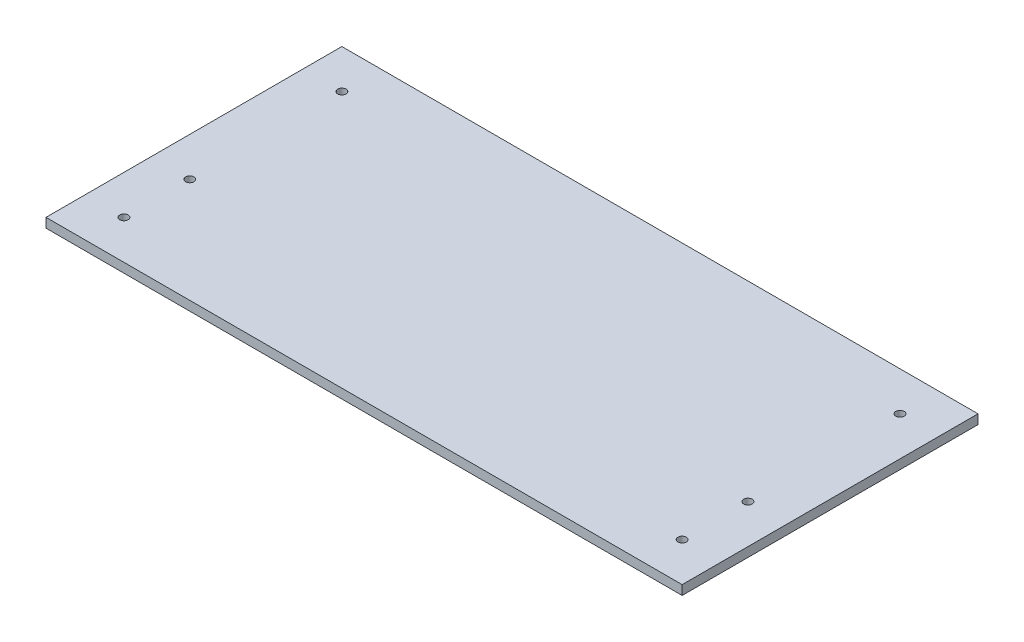
ISO-10303-21;
HEADER;
FILE_DESCRIPTION(('STEP AP214'),'2;1');
FILE_NAME('part.step','',(''),(''),'','','');
FILE_SCHEMA(('AUTOMOTIVE_DESIGN { 1 0 10303 214 1 1 1 1 }'));
ENDSEC;
DATA;
#1=APPLICATION_CONTEXT('core data for automotive mechanical design processes');
#2=APPLICATION_PROTOCOL_DEFINITION('international standard','automotive_design',2000,#1);
#3=PRODUCT_CONTEXT('',#1,'mechanical');
#4=PRODUCT('Part','Part','',(#3));
#5=PRODUCT_RELATED_PRODUCT_CATEGORY('part','',(#4));
#6=PRODUCT_DEFINITION_FORMATION('','',#4);
#7=PRODUCT_DEFINITION_CONTEXT('part definition',#1,'design');
#8=PRODUCT_DEFINITION('design','',#6,#7);
#9=PRODUCT_DEFINITION_SHAPE('','',#8);
#10=(LENGTH_UNIT() NAMED_UNIT(*) SI_UNIT(.MILLI.,.METRE.));
#11=(NAMED_UNIT(*) PLANE_ANGLE_UNIT() SI_UNIT($,.RADIAN.));
#12=(NAMED_UNIT(*) SI_UNIT($,.STERADIAN.) SOLID_ANGLE_UNIT());
#13=UNCERTAINTY_MEASURE_WITH_UNIT(LENGTH_MEASURE(1.E-05),#10,'distance_accuracy_value','');
#14=(GEOMETRIC_REPRESENTATION_CONTEXT(3) GLOBAL_UNCERTAINTY_ASSIGNED_CONTEXT((#13)) GLOBAL_UNIT_ASSIGNED_CONTEXT((#10,
#11,#12)) REPRESENTATION_CONTEXT('',''));
#15=CARTESIAN_POINT('',(0.,0.,0.));
#16=DIRECTION('',(0.,0.,1.));
#17=DIRECTION('',(1.,0.,0.));
#18=AXIS2_PLACEMENT_3D('',#15,#16,#17);
#19=CARTESIAN_POINT('',(107.505,3.18,50.));
#20=DIRECTION('',(-1.,0.,0.));
#21=DIRECTION('',(0.,0.,1.));
#22=AXIS2_PLACEMENT_3D('',#19,#20,#21);
#23=PLANE('',#22);
#24=DIRECTION('',(0.,0.,-1.));
#25=VECTOR('',#24,1.);
#26=CARTESIAN_POINT('',(107.505,0.,50.));
#27=LINE('',#26,#25);
#28=CARTESIAN_POINT('',(107.505,0.,50.));
#29=VERTEX_POINT('',#28);
#30=CARTESIAN_POINT('',(107.505,0.,-50.));
#31=VERTEX_POINT('',#30);
#32=EDGE_CURVE('E95',#29,#31,#27,.T.);
#33=ORIENTED_EDGE('',*,*,#32,.T.);
#34=DIRECTION('',(0.,-1.,0.));
#35=VECTOR('',#34,1.);
#36=CARTESIAN_POINT('',(107.505,3.18,-50.));
#37=LINE('',#36,#35);
#38=CARTESIAN_POINT('',(107.505,3.18,-50.));
#39=VERTEX_POINT('',#38);
#40=EDGE_CURVE('E11',#39,#31,#37,.T.);
#41=ORIENTED_EDGE('',*,*,#40,.F.);
#42=DIRECTION('',(0.,0.,-1.));
#43=VECTOR('',#42,1.);
#44=CARTESIAN_POINT('',(107.505,3.18,50.));
#45=LINE('',#44,#43);
#46=CARTESIAN_POINT('',(107.505,3.18,50.));
#47=VERTEX_POINT('',#46);
#48=EDGE_CURVE('E83',#47,#39,#45,.T.);
#49=ORIENTED_EDGE('',*,*,#48,.F.);
#50=DIRECTION('',(0.,-1.,0.));
#51=VECTOR('',#50,1.);
#52=CARTESIAN_POINT('',(107.505,3.18,50.));
#53=LINE('',#52,#51);
#54=EDGE_CURVE('E91',#47,#29,#53,.T.);
#55=ORIENTED_EDGE('',*,*,#54,.T.);
#56=EDGE_LOOP('',(#33,#41,#49,#55));
#57=FACE_BOUND('',#56,.T.);
#58=ADVANCED_FACE('F32',(#57),#23,.F.);
#59=CARTESIAN_POINT('',(-107.505,3.18,-50.));
#60=DIRECTION('',(0.,0.,1.));
#61=DIRECTION('',(1.,0.,0.));
#62=AXIS2_PLACEMENT_3D('',#59,#60,#61);
#63=PLANE('',#62);
#64=DIRECTION('',(-1.,0.,0.));
#65=VECTOR('',#64,1.);
#66=CARTESIAN_POINT('',(-107.505,0.,-50.));
#67=LINE('',#66,#65);
#68=CARTESIAN_POINT('',(-107.505,0.,-50.));
#69=VERTEX_POINT('',#68);
#70=EDGE_CURVE('E87',#31,#69,#67,.T.);
#71=ORIENTED_EDGE('',*,*,#70,.T.);
#72=DIRECTION('',(0.,-1.,0.));
#73=VECTOR('',#72,1.);
#74=CARTESIAN_POINT('',(-107.505,3.18,-50.));
#75=LINE('',#74,#73);
#76=CARTESIAN_POINT('',(-107.505,3.18,-50.));
#77=VERTEX_POINT('',#76);
#78=EDGE_CURVE('E40',#77,#69,#75,.T.);
#79=ORIENTED_EDGE('',*,*,#78,.F.);
#80=DIRECTION('',(-1.,0.,0.));
#81=VECTOR('',#80,1.);
#82=CARTESIAN_POINT('',(-107.505,3.18,-50.));
#83=LINE('',#82,#81);
#84=EDGE_CURVE('E78',#39,#77,#83,.T.);
#85=ORIENTED_EDGE('',*,*,#84,.F.);
#86=ORIENTED_EDGE('',*,*,#40,.T.);
#87=EDGE_LOOP('',(#71,#79,#85,#86));
#88=FACE_BOUND('',#87,.T.);
#89=ADVANCED_FACE('F86',(#88),#63,.F.);
#90=CARTESIAN_POINT('',(-107.505,3.18,50.));
#91=DIRECTION('',(1.,0.,0.));
#92=DIRECTION('',(0.,0.,-1.));
#93=AXIS2_PLACEMENT_3D('',#90,#91,#92);
#94=PLANE('',#93);
#95=DIRECTION('',(0.,0.,1.));
#96=VECTOR('',#95,1.);
#97=CARTESIAN_POINT('',(-107.505,0.,50.));
#98=LINE('',#97,#96);
#99=CARTESIAN_POINT('',(-107.505,0.,50.));
#100=VERTEX_POINT('',#99);
#101=EDGE_CURVE('E65',#69,#100,#98,.T.);
#102=ORIENTED_EDGE('',*,*,#101,.T.);
#103=DIRECTION('',(0.,-1.,0.));
#104=VECTOR('',#103,1.);
#105=CARTESIAN_POINT('',(-107.505,3.18,50.));
#106=LINE('',#105,#104);
#107=CARTESIAN_POINT('',(-107.505,3.18,50.));
#108=VERTEX_POINT('',#107);
#109=EDGE_CURVE('E88',#108,#100,#106,.T.);
#110=ORIENTED_EDGE('',*,*,#109,.F.);
#111=DIRECTION('',(0.,0.,1.));
#112=VECTOR('',#111,1.);
#113=CARTESIAN_POINT('',(-107.505,3.18,50.));
#114=LINE('',#113,#112);
#115=EDGE_CURVE('E81',#77,#108,#114,.T.);
#116=ORIENTED_EDGE('',*,*,#115,.F.);
#117=ORIENTED_EDGE('',*,*,#78,.T.);
#118=EDGE_LOOP('',(#102,#110,#116,#117));
#119=FACE_BOUND('',#118,.T.);
#120=ADVANCED_FACE('F89',(#119),#94,.F.);
#121=CARTESIAN_POINT('',(-107.505,3.18,50.));
#122=DIRECTION('',(0.,0.,-1.));
#123=DIRECTION('',(-1.,0.,0.));
#124=AXIS2_PLACEMENT_3D('',#121,#122,#123);
#125=PLANE('',#124);
#126=DIRECTION('',(1.,0.,0.));
#127=VECTOR('',#126,1.);
#128=CARTESIAN_POINT('',(-107.505,0.,50.));
#129=LINE('',#128,#127);
#130=EDGE_CURVE('E71',#100,#29,#129,.T.);
#131=ORIENTED_EDGE('',*,*,#130,.T.);
#132=ORIENTED_EDGE('',*,*,#54,.F.);
#133=DIRECTION('',(1.,0.,0.));
#134=VECTOR('',#133,1.);
#135=CARTESIAN_POINT('',(-107.505,3.18,50.));
#136=LINE('',#135,#134);
#137=EDGE_CURVE('E48',#108,#47,#136,.T.);
#138=ORIENTED_EDGE('',*,*,#137,.F.);
#139=ORIENTED_EDGE('',*,*,#109,.T.);
#140=EDGE_LOOP('',(#131,#132,#138,#139));
#141=FACE_BOUND('',#140,.T.);
#142=ADVANCED_FACE('F103',(#141),#125,.F.);
#143=CARTESIAN_POINT('',(0.,3.18,0.));
#144=DIRECTION('',(0.,-1.,0.));
#145=DIRECTION('',(0.,0.,-1.));
#146=AXIS2_PLACEMENT_3D('',#143,#144,#145);
#147=PLANE('',#146);
#148=CARTESIAN_POINT('',(-94.3250000000001,3.18,14.58));
#149=DIRECTION('',(0.,-1.,0.));
#150=DIRECTION('',(0.,0.,-1.));
#151=AXIS2_PLACEMENT_3D('',#148,#149,#150);
#152=CIRCLE('',#151,1.42239999999999);
#153=CARTESIAN_POINT('',(-94.3250000000001,3.18,13.1576));
#154=VERTEX_POINT('',#153);
#155=EDGE_CURVE('E125',#154,#154,#152,.T.);
#156=ORIENTED_EDGE('',*,*,#155,.T.);
#157=EDGE_LOOP('',(#156));
#158=FACE_BOUND('',#157,.T.);
#159=CARTESIAN_POINT('',(94.3249999999999,3.18,14.58));
#160=DIRECTION('',(0.,-1.,0.));
#161=DIRECTION('',(0.,0.,-1.));
#162=AXIS2_PLACEMENT_3D('',#159,#160,#161);
#163=CIRCLE('',#162,1.42239999999999);
#164=CARTESIAN_POINT('',(94.3249999999999,3.18,13.1576));
#165=VERTEX_POINT('',#164);
#166=EDGE_CURVE('E136',#165,#165,#163,.T.);
#167=ORIENTED_EDGE('',*,*,#166,.T.);
#168=EDGE_LOOP('',(#167));
#169=FACE_BOUND('',#168,.T.);
#170=CARTESIAN_POINT('',(-94.3250000000001,3.18,36.825));
#171=DIRECTION('',(0.,1.,0.));
#172=DIRECTION('',(0.,0.,1.));
#173=AXIS2_PLACEMENT_3D('',#170,#171,#172);
#174=CIRCLE('',#173,1.42240000000001);
#175=CARTESIAN_POINT('',(-94.3250000000001,3.18,35.4026));
#176=VERTEX_POINT('',#175);
#177=EDGE_CURVE('E113',#176,#176,#174,.T.);
#178=ORIENTED_EDGE('',*,*,#177,.F.);
#179=EDGE_LOOP('',(#178));
#180=FACE_BOUND('',#179,.T.);
#181=CARTESIAN_POINT('',(94.325,3.18,36.82));
#182=DIRECTION('',(0.,1.,0.));
#183=DIRECTION('',(0.,0.,1.));
#184=AXIS2_PLACEMENT_3D('',#181,#182,#183);
#185=CIRCLE('',#184,1.42240000000001);
#186=CARTESIAN_POINT('',(94.325,3.18,35.3976));
#187=VERTEX_POINT('',#186);
#188=EDGE_CURVE('E124',#187,#187,#185,.T.);
#189=ORIENTED_EDGE('',*,*,#188,.F.);
#190=EDGE_LOOP('',(#189));
#191=FACE_BOUND('',#190,.T.);
#192=CARTESIAN_POINT('',(-94.3250000000001,3.18,-36.825));
#193=DIRECTION('',(0.,-1.,0.));
#194=DIRECTION('',(0.,0.,-1.));
#195=AXIS2_PLACEMENT_3D('',#192,#193,#194);
#196=CIRCLE('',#195,1.42240000000001);
#197=CARTESIAN_POINT('',(-94.3250000000001,3.18,-38.2474));
#198=VERTEX_POINT('',#197);
#199=EDGE_CURVE('E98',#198,#198,#196,.T.);
#200=ORIENTED_EDGE('',*,*,#199,.T.);
#201=EDGE_LOOP('',(#200));
#202=FACE_BOUND('',#201,.T.);
#203=CARTESIAN_POINT('',(94.325,3.18,-36.82));
#204=DIRECTION('',(0.,-1.,0.));
#205=DIRECTION('',(0.,0.,-1.));
#206=AXIS2_PLACEMENT_3D('',#203,#204,#205);
#207=CIRCLE('',#206,1.42240000000001);
#208=CARTESIAN_POINT('',(94.325,3.18,-38.2424));
#209=VERTEX_POINT('',#208);
#210=EDGE_CURVE('E112',#209,#209,#207,.T.);
#211=ORIENTED_EDGE('',*,*,#210,.T.);
#212=EDGE_LOOP('',(#211));
#213=FACE_BOUND('',#212,.T.);
#214=ORIENTED_EDGE('',*,*,#48,.T.);
#215=ORIENTED_EDGE('',*,*,#84,.T.);
#216=ORIENTED_EDGE('',*,*,#115,.T.);
#217=ORIENTED_EDGE('',*,*,#137,.T.);
#218=EDGE_LOOP('',(#214,#215,#216,#217));
#219=FACE_BOUND('',#218,.T.);
#220=ADVANCED_FACE('F79',(#158,#169,#180,#191,#202,#213,#219),#147,.F.);
#221=CARTESIAN_POINT('',(0.,0.,0.));
#222=DIRECTION('',(0.,-1.,0.));
#223=DIRECTION('',(0.,0.,-1.));
#224=AXIS2_PLACEMENT_3D('',#221,#222,#223);
#225=PLANE('',#224);
#226=CARTESIAN_POINT('',(-94.3250000000001,0.,14.58));
#227=DIRECTION('',(0.,-1.,0.));
#228=DIRECTION('',(0.,0.,-1.));
#229=AXIS2_PLACEMENT_3D('',#226,#227,#228);
#230=CIRCLE('',#229,1.42239999999999);
#231=CARTESIAN_POINT('',(-94.3250000000001,0.,13.1576));
#232=VERTEX_POINT('',#231);
#233=EDGE_CURVE('E139',#232,#232,#230,.T.);
#234=ORIENTED_EDGE('',*,*,#233,.F.);
#235=EDGE_LOOP('',(#234));
#236=FACE_BOUND('',#235,.T.);
#237=CARTESIAN_POINT('',(94.3249999999999,0.,14.58));
#238=DIRECTION('',(0.,-1.,0.));
#239=DIRECTION('',(0.,0.,-1.));
#240=AXIS2_PLACEMENT_3D('',#237,#238,#239);
#241=CIRCLE('',#240,1.42239999999999);
#242=CARTESIAN_POINT('',(94.3249999999999,0.,13.1576));
#243=VERTEX_POINT('',#242);
#244=EDGE_CURVE('E133',#243,#243,#241,.T.);
#245=ORIENTED_EDGE('',*,*,#244,.F.);
#246=EDGE_LOOP('',(#245));
#247=FACE_BOUND('',#246,.T.);
#248=CARTESIAN_POINT('',(-94.3250000000001,0.,36.825));
#249=DIRECTION('',(0.,1.,0.));
#250=DIRECTION('',(0.,0.,1.));
#251=AXIS2_PLACEMENT_3D('',#248,#249,#250);
#252=CIRCLE('',#251,1.42240000000001);
#253=CARTESIAN_POINT('',(-94.3250000000001,0.,35.4026));
#254=VERTEX_POINT('',#253);
#255=EDGE_CURVE('E128',#254,#254,#252,.T.);
#256=ORIENTED_EDGE('',*,*,#255,.T.);
#257=EDGE_LOOP('',(#256));
#258=FACE_BOUND('',#257,.T.);
#259=CARTESIAN_POINT('',(94.325,0.,36.82));
#260=DIRECTION('',(0.,1.,0.));
#261=DIRECTION('',(0.,0.,1.));
#262=AXIS2_PLACEMENT_3D('',#259,#260,#261);
#263=CIRCLE('',#262,1.42240000000001);
#264=CARTESIAN_POINT('',(94.325,0.,35.3976));
#265=VERTEX_POINT('',#264);
#266=EDGE_CURVE('E121',#265,#265,#263,.T.);
#267=ORIENTED_EDGE('',*,*,#266,.T.);
#268=EDGE_LOOP('',(#267));
#269=FACE_BOUND('',#268,.T.);
#270=CARTESIAN_POINT('',(-94.3250000000001,0.,-36.825));
#271=DIRECTION('',(0.,-1.,0.));
#272=DIRECTION('',(0.,0.,-1.));
#273=AXIS2_PLACEMENT_3D('',#270,#271,#272);
#274=CIRCLE('',#273,1.42240000000001);
#275=CARTESIAN_POINT('',(-94.3250000000001,0.,-38.2474));
#276=VERTEX_POINT('',#275);
#277=EDGE_CURVE('E116',#276,#276,#274,.T.);
#278=ORIENTED_EDGE('',*,*,#277,.F.);
#279=EDGE_LOOP('',(#278));
#280=FACE_BOUND('',#279,.T.);
#281=CARTESIAN_POINT('',(94.325,0.,-36.82));
#282=DIRECTION('',(0.,-1.,0.));
#283=DIRECTION('',(0.,0.,-1.));
#284=AXIS2_PLACEMENT_3D('',#281,#282,#283);
#285=CIRCLE('',#284,1.42240000000001);
#286=CARTESIAN_POINT('',(94.325,0.,-38.2424));
#287=VERTEX_POINT('',#286);
#288=EDGE_CURVE('E109',#287,#287,#285,.T.);
#289=ORIENTED_EDGE('',*,*,#288,.F.);
#290=EDGE_LOOP('',(#289));
#291=FACE_BOUND('',#290,.T.);
#292=ORIENTED_EDGE('',*,*,#32,.F.);
#293=ORIENTED_EDGE('',*,*,#130,.F.);
#294=ORIENTED_EDGE('',*,*,#101,.F.);
#295=ORIENTED_EDGE('',*,*,#70,.F.);
#296=EDGE_LOOP('',(#292,#293,#294,#295));
#297=FACE_BOUND('',#296,.T.);
#298=ADVANCED_FACE('F106',(#236,#247,#258,#269,#280,#291,#297),#225,.T.);
#299=CARTESIAN_POINT('',(94.325,3.18,-36.82));
#300=DIRECTION('',(0.,-1.,0.));
#301=DIRECTION('',(0.,0.,-1.));
#302=AXIS2_PLACEMENT_3D('',#299,#300,#301);
#303=CYLINDRICAL_SURFACE('',#302,1.42240000000001);
#304=CARTESIAN_POINT('',(94.325,3.18,-38.2424));
#305=CARTESIAN_POINT('',(94.325,3.146875,-38.2424));
#306=CARTESIAN_POINT('',(94.325,3.11375,-38.2424));
#307=CARTESIAN_POINT('',(94.325,3.0475,-38.2424));
#308=CARTESIAN_POINT('',(94.325,3.014375,-38.2424));
#309=CARTESIAN_POINT('',(94.325,2.948125,-38.2424));
#310=CARTESIAN_POINT('',(94.325,2.915,-38.2424));
#311=CARTESIAN_POINT('',(94.325,2.84875,-38.2424));
#312=CARTESIAN_POINT('',(94.325,2.815625,-38.2424));
#313=CARTESIAN_POINT('',(94.325,2.749375,-38.2424));
#314=CARTESIAN_POINT('',(94.325,2.71625,-38.2424));
#315=CARTESIAN_POINT('',(94.325,2.65,-38.2424));
#316=CARTESIAN_POINT('',(94.325,2.616875,-38.2424));
#317=CARTESIAN_POINT('',(94.325,2.550625,-38.2424));
#318=CARTESIAN_POINT('',(94.325,2.5175,-38.2424));
#319=CARTESIAN_POINT('',(94.325,2.45125,-38.2424));
#320=CARTESIAN_POINT('',(94.325,2.418125,-38.2424));
#321=CARTESIAN_POINT('',(94.325,2.351875,-38.2424));
#322=CARTESIAN_POINT('',(94.325,2.31875,-38.2424));
#323=CARTESIAN_POINT('',(94.325,2.2525,-38.2424));
#324=CARTESIAN_POINT('',(94.325,2.219375,-38.2424));
#325=CARTESIAN_POINT('',(94.325,2.153125,-38.2424));
#326=CARTESIAN_POINT('',(94.325,2.12,-38.2424));
#327=CARTESIAN_POINT('',(94.325,2.05375,-38.2424));
#328=CARTESIAN_POINT('',(94.325,2.020625,-38.2424));
#329=CARTESIAN_POINT('',(94.325,1.954375,-38.2424));
#330=CARTESIAN_POINT('',(94.325,1.92125,-38.2424));
#331=CARTESIAN_POINT('',(94.325,1.855,-38.2424));
#332=CARTESIAN_POINT('',(94.325,1.821875,-38.2424));
#333=CARTESIAN_POINT('',(94.325,1.755625,-38.2424));
#334=CARTESIAN_POINT('',(94.325,1.7225,-38.2424));
#335=CARTESIAN_POINT('',(94.325,1.65625,-38.2424));
#336=CARTESIAN_POINT('',(94.325,1.623125,-38.2424));
#337=CARTESIAN_POINT('',(94.325,1.556875,-38.2424));
#338=CARTESIAN_POINT('',(94.325,1.52375,-38.2424));
#339=CARTESIAN_POINT('',(94.325,1.4575,-38.2424));
#340=CARTESIAN_POINT('',(94.325,1.424375,-38.2424));
#341=CARTESIAN_POINT('',(94.325,1.358125,-38.2424));
#342=CARTESIAN_POINT('',(94.325,1.325,-38.2424));
#343=CARTESIAN_POINT('',(94.325,1.25875,-38.2424));
#344=CARTESIAN_POINT('',(94.325,1.225625,-38.2424));
#345=CARTESIAN_POINT('',(94.325,1.159375,-38.2424));
#346=CARTESIAN_POINT('',(94.325,1.12625,-38.2424));
#347=CARTESIAN_POINT('',(94.325,1.06,-38.2424));
#348=CARTESIAN_POINT('',(94.325,1.026875,-38.2424));
#349=CARTESIAN_POINT('',(94.325,0.960625,-38.2424));
#350=CARTESIAN_POINT('',(94.325,0.9275,-38.2424));
#351=CARTESIAN_POINT('',(94.325,0.86125,-38.2424));
#352=CARTESIAN_POINT('',(94.325,0.828125,-38.2424));
#353=CARTESIAN_POINT('',(94.325,0.761875,-38.2424));
#354=CARTESIAN_POINT('',(94.325,0.72875,-38.2424));
#355=CARTESIAN_POINT('',(94.325,0.6625,-38.2424));
#356=CARTESIAN_POINT('',(94.325,0.629375,-38.2424));
#357=CARTESIAN_POINT('',(94.325,0.563125,-38.2424));
#358=CARTESIAN_POINT('',(94.325,0.53,-38.2424));
#359=CARTESIAN_POINT('',(94.325,0.46375,-38.2424));
#360=CARTESIAN_POINT('',(94.325,0.430625,-38.2424));
#361=CARTESIAN_POINT('',(94.325,0.364375,-38.2424));
#362=CARTESIAN_POINT('',(94.325,0.33125,-38.2424));
#363=CARTESIAN_POINT('',(94.325,0.265,-38.2424));
#364=CARTESIAN_POINT('',(94.325,0.231875,-38.2424));
#365=CARTESIAN_POINT('',(94.325,0.165625,-38.2424));
#366=CARTESIAN_POINT('',(94.325,0.1325,-38.2424));
#367=CARTESIAN_POINT('',(94.325,0.06625,-38.2424));
#368=CARTESIAN_POINT('',(94.325,0.033125,-38.2424));
#369=CARTESIAN_POINT('',(94.325,0.,-38.2424));
#370=B_SPLINE_CURVE_WITH_KNOTS('',3,(#304,#305,#306,#307,#308,#309,#310,#311,#312,#313,#314,
#315,#316,#317,#318,#319,#320,#321,#322,#323,#324,#325,#326,#327,#328,#329,#330,#331,#332,#333,
#334,#335,#336,#337,#338,#339,#340,#341,#342,#343,#344,#345,#346,#347,#348,#349,#350,#351,#352,
#353,#354,#355,#356,#357,#358,#359,#360,#361,#362,#363,#364,#365,#366,#367,#368,#369),
.UNSPECIFIED.,.F.,.F.,(4,2,2,2,2,2,2,2,2,2,2,2,2,2,2,2,2,2,2,2,2,2,2,2,2,2,2,2,2,2,2,2,4),(0.,
0.0993750000000001,0.19875,0.298125,0.3975,0.496875,0.59625,0.695625,0.795000000000001,0.894375,
0.99375,1.093125,1.1925,1.291875,1.39125,1.490625,1.59,1.689375,1.78875,1.888125,1.9875,
2.086875,2.18625,2.285625,2.385,2.484375,2.58375,2.683125,2.7825,2.881875,2.98125,3.080625,
3.18),.UNSPECIFIED.);
#371=EDGE_CURVE('BSEAM156',#209,#287,#370,.T.);
#372=ORIENTED_EDGE('',*,*,#210,.F.);
#373=ORIENTED_EDGE('',*,*,#288,.T.);
#374=ORIENTED_EDGE('',*,*,#371,.T.);
#375=ORIENTED_EDGE('',*,*,#371,.F.);
#376=EDGE_LOOP('',(#372,#374,#373,#375));
#377=FACE_BOUND('',#376,.T.);
#378=ADVANCED_FACE('F156',(#377),#303,.F.);
#379=CARTESIAN_POINT('',(-94.3250000000001,3.18,-36.825));
#380=DIRECTION('',(0.,-1.,0.));
#381=DIRECTION('',(0.,0.,-1.));
#382=AXIS2_PLACEMENT_3D('',#379,#380,#381);
#383=CYLINDRICAL_SURFACE('',#382,1.42240000000001);
#384=CARTESIAN_POINT('',(-94.3250000000001,3.18,-38.2474));
#385=CARTESIAN_POINT('',(-94.3250000000001,3.146875,-38.2474));
#386=CARTESIAN_POINT('',(-94.3250000000001,3.11375,-38.2474));
#387=CARTESIAN_POINT('',(-94.3250000000001,3.0475,-38.2474));
#388=CARTESIAN_POINT('',(-94.3250000000001,3.014375,-38.2474));
#389=CARTESIAN_POINT('',(-94.3250000000001,2.948125,-38.2474));
#390=CARTESIAN_POINT('',(-94.3250000000001,2.915,-38.2474));
#391=CARTESIAN_POINT('',(-94.3250000000001,2.84875,-38.2474));
#392=CARTESIAN_POINT('',(-94.3250000000001,2.815625,-38.2474));
#393=CARTESIAN_POINT('',(-94.3250000000001,2.749375,-38.2474));
#394=CARTESIAN_POINT('',(-94.3250000000001,2.71625,-38.2474));
#395=CARTESIAN_POINT('',(-94.3250000000001,2.65,-38.2474));
#396=CARTESIAN_POINT('',(-94.3250000000001,2.616875,-38.2474));
#397=CARTESIAN_POINT('',(-94.3250000000001,2.550625,-38.2474));
#398=CARTESIAN_POINT('',(-94.3250000000001,2.5175,-38.2474));
#399=CARTESIAN_POINT('',(-94.3250000000001,2.45125,-38.2474));
#400=CARTESIAN_POINT('',(-94.3250000000001,2.418125,-38.2474));
#401=CARTESIAN_POINT('',(-94.3250000000001,2.351875,-38.2474));
#402=CARTESIAN_POINT('',(-94.3250000000001,2.31875,-38.2474));
#403=CARTESIAN_POINT('',(-94.3250000000001,2.2525,-38.2474));
#404=CARTESIAN_POINT('',(-94.3250000000001,2.219375,-38.2474));
#405=CARTESIAN_POINT('',(-94.3250000000001,2.153125,-38.2474));
#406=CARTESIAN_POINT('',(-94.3250000000001,2.12,-38.2474));
#407=CARTESIAN_POINT('',(-94.3250000000001,2.05375,-38.2474));
#408=CARTESIAN_POINT('',(-94.3250000000001,2.020625,-38.2474));
#409=CARTESIAN_POINT('',(-94.3250000000001,1.954375,-38.2474));
#410=CARTESIAN_POINT('',(-94.3250000000001,1.92125,-38.2474));
#411=CARTESIAN_POINT('',(-94.3250000000001,1.855,-38.2474));
#412=CARTESIAN_POINT('',(-94.3250000000001,1.821875,-38.2474));
#413=CARTESIAN_POINT('',(-94.3250000000001,1.755625,-38.2474));
#414=CARTESIAN_POINT('',(-94.3250000000001,1.7225,-38.2474));
#415=CARTESIAN_POINT('',(-94.3250000000001,1.65625,-38.2474));
#416=CARTESIAN_POINT('',(-94.3250000000001,1.623125,-38.2474));
#417=CARTESIAN_POINT('',(-94.3250000000001,1.556875,-38.2474));
#418=CARTESIAN_POINT('',(-94.3250000000001,1.52375,-38.2474));
#419=CARTESIAN_POINT('',(-94.3250000000001,1.4575,-38.2474));
#420=CARTESIAN_POINT('',(-94.3250000000001,1.424375,-38.2474));
#421=CARTESIAN_POINT('',(-94.3250000000001,1.358125,-38.2474));
#422=CARTESIAN_POINT('',(-94.3250000000001,1.325,-38.2474));
#423=CARTESIAN_POINT('',(-94.3250000000001,1.25875,-38.2474));
#424=CARTESIAN_POINT('',(-94.3250000000001,1.225625,-38.2474));
#425=CARTESIAN_POINT('',(-94.3250000000001,1.159375,-38.2474));
#426=CARTESIAN_POINT('',(-94.3250000000001,1.12625,-38.2474));
#427=CARTESIAN_POINT('',(-94.3250000000001,1.06,-38.2474));
#428=CARTESIAN_POINT('',(-94.3250000000001,1.026875,-38.2474));
#429=CARTESIAN_POINT('',(-94.3250000000001,0.960625,-38.2474));
#430=CARTESIAN_POINT('',(-94.3250000000001,0.9275,-38.2474));
#431=CARTESIAN_POINT('',(-94.3250000000001,0.86125,-38.2474));
#432=CARTESIAN_POINT('',(-94.3250000000001,0.828125,-38.2474));
#433=CARTESIAN_POINT('',(-94.3250000000001,0.761875,-38.2474));
#434=CARTESIAN_POINT('',(-94.3250000000001,0.72875,-38.2474));
#435=CARTESIAN_POINT('',(-94.3250000000001,0.6625,-38.2474));
#436=CARTESIAN_POINT('',(-94.3250000000001,0.629375,-38.2474));
#437=CARTESIAN_POINT('',(-94.3250000000001,0.563125,-38.2474));
#438=CARTESIAN_POINT('',(-94.3250000000001,0.53,-38.2474));
#439=CARTESIAN_POINT('',(-94.3250000000001,0.46375,-38.2474));
#440=CARTESIAN_POINT('',(-94.3250000000001,0.430625,-38.2474));
#441=CARTESIAN_POINT('',(-94.3250000000001,0.364375,-38.2474));
#442=CARTESIAN_POINT('',(-94.3250000000001,0.33125,-38.2474));
#443=CARTESIAN_POINT('',(-94.3250000000001,0.265,-38.2474));
#444=CARTESIAN_POINT('',(-94.3250000000001,0.231875,-38.2474));
#445=CARTESIAN_POINT('',(-94.3250000000001,0.165625,-38.2474));
#446=CARTESIAN_POINT('',(-94.3250000000001,0.1325,-38.2474));
#447=CARTESIAN_POINT('',(-94.3250000000001,0.06625,-38.2474));
#448=CARTESIAN_POINT('',(-94.3250000000001,0.033125,-38.2474));
#449=CARTESIAN_POINT('',(-94.3250000000001,0.,-38.2474));
#450=B_SPLINE_CURVE_WITH_KNOTS('',3,(#384,#385,#386,#387,#388,#389,#390,#391,#392,#393,#394,
#395,#396,#397,#398,#399,#400,#401,#402,#403,#404,#405,#406,#407,#408,#409,#410,#411,#412,#413,
#414,#415,#416,#417,#418,#419,#420,#421,#422,#423,#424,#425,#426,#427,#428,#429,#430,#431,#432,
#433,#434,#435,#436,#437,#438,#439,#440,#441,#442,#443,#444,#445,#446,#447,#448,#449),
.UNSPECIFIED.,.F.,.F.,(4,2,2,2,2,2,2,2,2,2,2,2,2,2,2,2,2,2,2,2,2,2,2,2,2,2,2,2,2,2,2,2,4),(0.,
0.0993750000000001,0.19875,0.298125,0.3975,0.496875,0.59625,0.695625,0.795000000000001,0.894375,
0.99375,1.093125,1.1925,1.291875,1.39125,1.490625,1.59,1.689375,1.78875,1.888125,1.9875,
2.086875,2.18625,2.285625,2.385,2.484375,2.58375,2.683125,2.7825,2.881875,2.98125,3.080625,
3.18),.UNSPECIFIED.);
#451=EDGE_CURVE('BSEAM169',#198,#276,#450,.T.);
#452=ORIENTED_EDGE('',*,*,#199,.F.);
#453=ORIENTED_EDGE('',*,*,#277,.T.);
#454=ORIENTED_EDGE('',*,*,#451,.T.);
#455=ORIENTED_EDGE('',*,*,#451,.F.);
#456=EDGE_LOOP('',(#452,#454,#453,#455));
#457=FACE_BOUND('',#456,.T.);
#458=ADVANCED_FACE('F169',(#457),#383,.F.);
#459=CARTESIAN_POINT('',(94.325,3.18,36.82));
#460=DIRECTION('',(0.,-1.,0.));
#461=DIRECTION('',(0.,0.,-1.));
#462=AXIS2_PLACEMENT_3D('',#459,#460,#461);
#463=CYLINDRICAL_SURFACE('',#462,1.42240000000001);
#464=CARTESIAN_POINT('',(94.325,3.18,35.3976));
#465=CARTESIAN_POINT('',(94.325,3.146875,35.3976));
#466=CARTESIAN_POINT('',(94.325,3.11375,35.3976));
#467=CARTESIAN_POINT('',(94.325,3.0475,35.3976));
#468=CARTESIAN_POINT('',(94.325,3.014375,35.3976));
#469=CARTESIAN_POINT('',(94.325,2.948125,35.3976));
#470=CARTESIAN_POINT('',(94.325,2.915,35.3976));
#471=CARTESIAN_POINT('',(94.325,2.84875,35.3976));
#472=CARTESIAN_POINT('',(94.325,2.815625,35.3976));
#473=CARTESIAN_POINT('',(94.325,2.749375,35.3976));
#474=CARTESIAN_POINT('',(94.325,2.71625,35.3976));
#475=CARTESIAN_POINT('',(94.325,2.65,35.3976));
#476=CARTESIAN_POINT('',(94.325,2.616875,35.3976));
#477=CARTESIAN_POINT('',(94.325,2.550625,35.3976));
#478=CARTESIAN_POINT('',(94.325,2.5175,35.3976));
#479=CARTESIAN_POINT('',(94.325,2.45125,35.3976));
#480=CARTESIAN_POINT('',(94.325,2.418125,35.3976));
#481=CARTESIAN_POINT('',(94.325,2.351875,35.3976));
#482=CARTESIAN_POINT('',(94.325,2.31875,35.3976));
#483=CARTESIAN_POINT('',(94.325,2.2525,35.3976));
#484=CARTESIAN_POINT('',(94.325,2.219375,35.3976));
#485=CARTESIAN_POINT('',(94.325,2.153125,35.3976));
#486=CARTESIAN_POINT('',(94.325,2.12,35.3976));
#487=CARTESIAN_POINT('',(94.325,2.05375,35.3976));
#488=CARTESIAN_POINT('',(94.325,2.020625,35.3976));
#489=CARTESIAN_POINT('',(94.325,1.954375,35.3976));
#490=CARTESIAN_POINT('',(94.325,1.92125,35.3976));
#491=CARTESIAN_POINT('',(94.325,1.855,35.3976));
#492=CARTESIAN_POINT('',(94.325,1.821875,35.3976));
#493=CARTESIAN_POINT('',(94.325,1.755625,35.3976));
#494=CARTESIAN_POINT('',(94.325,1.7225,35.3976));
#495=CARTESIAN_POINT('',(94.325,1.65625,35.3976));
#496=CARTESIAN_POINT('',(94.325,1.623125,35.3976));
#497=CARTESIAN_POINT('',(94.325,1.556875,35.3976));
#498=CARTESIAN_POINT('',(94.325,1.52375,35.3976));
#499=CARTESIAN_POINT('',(94.325,1.4575,35.3976));
#500=CARTESIAN_POINT('',(94.325,1.424375,35.3976));
#501=CARTESIAN_POINT('',(94.325,1.358125,35.3976));
#502=CARTESIAN_POINT('',(94.325,1.325,35.3976));
#503=CARTESIAN_POINT('',(94.325,1.25875,35.3976));
#504=CARTESIAN_POINT('',(94.325,1.225625,35.3976));
#505=CARTESIAN_POINT('',(94.325,1.159375,35.3976));
#506=CARTESIAN_POINT('',(94.325,1.12625,35.3976));
#507=CARTESIAN_POINT('',(94.325,1.06,35.3976));
#508=CARTESIAN_POINT('',(94.325,1.026875,35.3976));
#509=CARTESIAN_POINT('',(94.325,0.960625,35.3976));
#510=CARTESIAN_POINT('',(94.325,0.9275,35.3976));
#511=CARTESIAN_POINT('',(94.325,0.86125,35.3976));
#512=CARTESIAN_POINT('',(94.325,0.828125,35.3976));
#513=CARTESIAN_POINT('',(94.325,0.761875,35.3976));
#514=CARTESIAN_POINT('',(94.325,0.72875,35.3976));
#515=CARTESIAN_POINT('',(94.325,0.6625,35.3976));
#516=CARTESIAN_POINT('',(94.325,0.629375,35.3976));
#517=CARTESIAN_POINT('',(94.325,0.563125,35.3976));
#518=CARTESIAN_POINT('',(94.325,0.53,35.3976));
#519=CARTESIAN_POINT('',(94.325,0.46375,35.3976));
#520=CARTESIAN_POINT('',(94.325,0.430625,35.3976));
#521=CARTESIAN_POINT('',(94.325,0.364375,35.3976));
#522=CARTESIAN_POINT('',(94.325,0.33125,35.3976));
#523=CARTESIAN_POINT('',(94.325,0.265,35.3976));
#524=CARTESIAN_POINT('',(94.325,0.231875,35.3976));
#525=CARTESIAN_POINT('',(94.325,0.165625,35.3976));
#526=CARTESIAN_POINT('',(94.325,0.1325,35.3976));
#527=CARTESIAN_POINT('',(94.325,0.06625,35.3976));
#528=CARTESIAN_POINT('',(94.325,0.033125,35.3976));
#529=CARTESIAN_POINT('',(94.325,0.,35.3976));
#530=B_SPLINE_CURVE_WITH_KNOTS('',3,(#464,#465,#466,#467,#468,#469,#470,#471,#472,#473,#474,
#475,#476,#477,#478,#479,#480,#481,#482,#483,#484,#485,#486,#487,#488,#489,#490,#491,#492,#493,
#494,#495,#496,#497,#498,#499,#500,#501,#502,#503,#504,#505,#506,#507,#508,#509,#510,#511,#512,
#513,#514,#515,#516,#517,#518,#519,#520,#521,#522,#523,#524,#525,#526,#527,#528,#529),
.UNSPECIFIED.,.F.,.F.,(4,2,2,2,2,2,2,2,2,2,2,2,2,2,2,2,2,2,2,2,2,2,2,2,2,2,2,2,2,2,2,2,4),(0.,
0.0993749999999996,0.19875,0.298125,0.3975,0.496875,0.59625,0.695625,0.795,0.894375,0.99375,
1.093125,1.1925,1.291875,1.39125,1.490625,1.59,1.689375,1.78875,1.888125,1.9875,2.086875,
2.18625,2.285625,2.385,2.484375,2.58375,2.683125,2.7825,2.881875,2.98125,3.080625,3.18),.UNSPECIFIED.);
#531=EDGE_CURVE('BSEAM176',#187,#265,#530,.T.);
#532=ORIENTED_EDGE('',*,*,#188,.T.);
#533=ORIENTED_EDGE('',*,*,#266,.F.);
#534=ORIENTED_EDGE('',*,*,#531,.T.);
#535=ORIENTED_EDGE('',*,*,#531,.F.);
#536=EDGE_LOOP('',(#532,#534,#533,#535));
#537=FACE_BOUND('',#536,.T.);
#538=ADVANCED_FACE('F176',(#537),#463,.F.);
#539=CARTESIAN_POINT('',(-94.3250000000001,3.18,36.825));
#540=DIRECTION('',(0.,-1.,0.));
#541=DIRECTION('',(0.,0.,-1.));
#542=AXIS2_PLACEMENT_3D('',#539,#540,#541);
#543=CYLINDRICAL_SURFACE('',#542,1.42240000000001);
#544=CARTESIAN_POINT('',(-94.3250000000001,3.18,35.4026));
#545=CARTESIAN_POINT('',(-94.3250000000001,3.146875,35.4026));
#546=CARTESIAN_POINT('',(-94.3250000000001,3.11375,35.4026));
#547=CARTESIAN_POINT('',(-94.3250000000001,3.0475,35.4026));
#548=CARTESIAN_POINT('',(-94.3250000000001,3.014375,35.4026));
#549=CARTESIAN_POINT('',(-94.3250000000001,2.948125,35.4026));
#550=CARTESIAN_POINT('',(-94.3250000000001,2.915,35.4026));
#551=CARTESIAN_POINT('',(-94.3250000000001,2.84875,35.4026));
#552=CARTESIAN_POINT('',(-94.3250000000001,2.815625,35.4026));
#553=CARTESIAN_POINT('',(-94.3250000000001,2.749375,35.4026));
#554=CARTESIAN_POINT('',(-94.3250000000001,2.71625,35.4026));
#555=CARTESIAN_POINT('',(-94.3250000000001,2.65,35.4026));
#556=CARTESIAN_POINT('',(-94.3250000000001,2.616875,35.4026));
#557=CARTESIAN_POINT('',(-94.3250000000001,2.550625,35.4026));
#558=CARTESIAN_POINT('',(-94.3250000000001,2.5175,35.4026));
#559=CARTESIAN_POINT('',(-94.3250000000001,2.45125,35.4026));
#560=CARTESIAN_POINT('',(-94.3250000000001,2.418125,35.4026));
#561=CARTESIAN_POINT('',(-94.3250000000001,2.351875,35.4026));
#562=CARTESIAN_POINT('',(-94.3250000000001,2.31875,35.4026));
#563=CARTESIAN_POINT('',(-94.3250000000001,2.2525,35.4026));
#564=CARTESIAN_POINT('',(-94.3250000000001,2.219375,35.4026));
#565=CARTESIAN_POINT('',(-94.3250000000001,2.153125,35.4026));
#566=CARTESIAN_POINT('',(-94.3250000000001,2.12,35.4026));
#567=CARTESIAN_POINT('',(-94.3250000000001,2.05375,35.4026));
#568=CARTESIAN_POINT('',(-94.3250000000001,2.020625,35.4026));
#569=CARTESIAN_POINT('',(-94.3250000000001,1.954375,35.4026));
#570=CARTESIAN_POINT('',(-94.3250000000001,1.92125,35.4026));
#571=CARTESIAN_POINT('',(-94.3250000000001,1.855,35.4026));
#572=CARTESIAN_POINT('',(-94.3250000000001,1.821875,35.4026));
#573=CARTESIAN_POINT('',(-94.3250000000001,1.755625,35.4026));
#574=CARTESIAN_POINT('',(-94.3250000000001,1.7225,35.4026));
#575=CARTESIAN_POINT('',(-94.3250000000001,1.65625,35.4026));
#576=CARTESIAN_POINT('',(-94.3250000000001,1.623125,35.4026));
#577=CARTESIAN_POINT('',(-94.3250000000001,1.556875,35.4026));
#578=CARTESIAN_POINT('',(-94.3250000000001,1.52375,35.4026));
#579=CARTESIAN_POINT('',(-94.3250000000001,1.4575,35.4026));
#580=CARTESIAN_POINT('',(-94.3250000000001,1.424375,35.4026));
#581=CARTESIAN_POINT('',(-94.3250000000001,1.358125,35.4026));
#582=CARTESIAN_POINT('',(-94.3250000000001,1.325,35.4026));
#583=CARTESIAN_POINT('',(-94.3250000000001,1.25875,35.4026));
#584=CARTESIAN_POINT('',(-94.3250000000001,1.225625,35.4026));
#585=CARTESIAN_POINT('',(-94.3250000000001,1.159375,35.4026));
#586=CARTESIAN_POINT('',(-94.3250000000001,1.12625,35.4026));
#587=CARTESIAN_POINT('',(-94.3250000000001,1.06,35.4026));
#588=CARTESIAN_POINT('',(-94.3250000000001,1.026875,35.4026));
#589=CARTESIAN_POINT('',(-94.3250000000001,0.960625,35.4026));
#590=CARTESIAN_POINT('',(-94.3250000000001,0.9275,35.4026));
#591=CARTESIAN_POINT('',(-94.3250000000001,0.86125,35.4026));
#592=CARTESIAN_POINT('',(-94.3250000000001,0.828125,35.4026));
#593=CARTESIAN_POINT('',(-94.3250000000001,0.761875,35.4026));
#594=CARTESIAN_POINT('',(-94.3250000000001,0.72875,35.4026));
#595=CARTESIAN_POINT('',(-94.3250000000001,0.6625,35.4026));
#596=CARTESIAN_POINT('',(-94.3250000000001,0.629375,35.4026));
#597=CARTESIAN_POINT('',(-94.3250000000001,0.563125,35.4026));
#598=CARTESIAN_POINT('',(-94.3250000000001,0.53,35.4026));
#599=CARTESIAN_POINT('',(-94.3250000000001,0.46375,35.4026));
#600=CARTESIAN_POINT('',(-94.3250000000001,0.430625,35.4026));
#601=CARTESIAN_POINT('',(-94.3250000000001,0.364375,35.4026));
#602=CARTESIAN_POINT('',(-94.3250000000001,0.33125,35.4026));
#603=CARTESIAN_POINT('',(-94.3250000000001,0.265,35.4026));
#604=CARTESIAN_POINT('',(-94.3250000000001,0.231875,35.4026));
#605=CARTESIAN_POINT('',(-94.3250000000001,0.165625,35.4026));
#606=CARTESIAN_POINT('',(-94.3250000000001,0.1325,35.4026));
#607=CARTESIAN_POINT('',(-94.3250000000001,0.06625,35.4026));
#608=CARTESIAN_POINT('',(-94.3250000000001,0.033125,35.4026));
#609=CARTESIAN_POINT('',(-94.3250000000001,0.,35.4026));
#610=B_SPLINE_CURVE_WITH_KNOTS('',3,(#544,#545,#546,#547,#548,#549,#550,#551,#552,#553,#554,
#555,#556,#557,#558,#559,#560,#561,#562,#563,#564,#565,#566,#567,#568,#569,#570,#571,#572,#573,
#574,#575,#576,#577,#578,#579,#580,#581,#582,#583,#584,#585,#586,#587,#588,#589,#590,#591,#592,
#593,#594,#595,#596,#597,#598,#599,#600,#601,#602,#603,#604,#605,#606,#607,#608,#609),
.UNSPECIFIED.,.F.,.F.,(4,2,2,2,2,2,2,2,2,2,2,2,2,2,2,2,2,2,2,2,2,2,2,2,2,2,2,2,2,2,2,2,4),(0.,
0.0993749999999996,0.19875,0.298125,0.3975,0.496875,0.59625,0.695625,0.795,0.894375,0.99375,
1.093125,1.1925,1.291875,1.39125,1.490625,1.59,1.689375,1.78875,1.888125,1.9875,2.086875,
2.18625,2.285625,2.385,2.484375,2.58375,2.683125,2.7825,2.881875,2.98125,3.080625,3.18),.UNSPECIFIED.);
#611=EDGE_CURVE('BSEAM197',#176,#254,#610,.T.);
#612=ORIENTED_EDGE('',*,*,#177,.T.);
#613=ORIENTED_EDGE('',*,*,#255,.F.);
#614=ORIENTED_EDGE('',*,*,#611,.T.);
#615=ORIENTED_EDGE('',*,*,#611,.F.);
#616=EDGE_LOOP('',(#612,#614,#613,#615));
#617=FACE_BOUND('',#616,.T.);
#618=ADVANCED_FACE('F197',(#617),#543,.F.);
#619=CARTESIAN_POINT('',(94.3249999999999,3.18,14.58));
#620=DIRECTION('',(0.,-1.,0.));
#621=DIRECTION('',(0.,0.,-1.));
#622=AXIS2_PLACEMENT_3D('',#619,#620,#621);
#623=CYLINDRICAL_SURFACE('',#622,1.42239999999999);
#624=CARTESIAN_POINT('',(94.3249999999999,3.18,13.1576));
#625=CARTESIAN_POINT('',(94.3249999999999,3.146875,13.1576));
#626=CARTESIAN_POINT('',(94.3249999999999,3.11375,13.1576));
#627=CARTESIAN_POINT('',(94.3249999999999,3.0475,13.1576));
#628=CARTESIAN_POINT('',(94.3249999999999,3.014375,13.1576));
#629=CARTESIAN_POINT('',(94.3249999999999,2.948125,13.1576));
#630=CARTESIAN_POINT('',(94.3249999999999,2.915,13.1576));
#631=CARTESIAN_POINT('',(94.3249999999999,2.84875,13.1576));
#632=CARTESIAN_POINT('',(94.3249999999999,2.815625,13.1576));
#633=CARTESIAN_POINT('',(94.3249999999999,2.749375,13.1576));
#634=CARTESIAN_POINT('',(94.3249999999999,2.71625,13.1576));
#635=CARTESIAN_POINT('',(94.3249999999999,2.65,13.1576));
#636=CARTESIAN_POINT('',(94.3249999999999,2.616875,13.1576));
#637=CARTESIAN_POINT('',(94.3249999999999,2.550625,13.1576));
#638=CARTESIAN_POINT('',(94.3249999999999,2.5175,13.1576));
#639=CARTESIAN_POINT('',(94.3249999999999,2.45125,13.1576));
#640=CARTESIAN_POINT('',(94.3249999999999,2.418125,13.1576));
#641=CARTESIAN_POINT('',(94.3249999999999,2.351875,13.1576));
#642=CARTESIAN_POINT('',(94.3249999999999,2.31875,13.1576));
#643=CARTESIAN_POINT('',(94.3249999999999,2.2525,13.1576));
#644=CARTESIAN_POINT('',(94.3249999999999,2.219375,13.1576));
#645=CARTESIAN_POINT('',(94.3249999999999,2.153125,13.1576));
#646=CARTESIAN_POINT('',(94.3249999999999,2.12,13.1576));
#647=CARTESIAN_POINT('',(94.3249999999999,2.05375,13.1576));
#648=CARTESIAN_POINT('',(94.3249999999999,2.020625,13.1576));
#649=CARTESIAN_POINT('',(94.3249999999999,1.954375,13.1576));
#650=CARTESIAN_POINT('',(94.3249999999999,1.92125,13.1576));
#651=CARTESIAN_POINT('',(94.3249999999999,1.855,13.1576));
#652=CARTESIAN_POINT('',(94.3249999999999,1.821875,13.1576));
#653=CARTESIAN_POINT('',(94.3249999999999,1.755625,13.1576));
#654=CARTESIAN_POINT('',(94.3249999999999,1.7225,13.1576));
#655=CARTESIAN_POINT('',(94.3249999999999,1.65625,13.1576));
#656=CARTESIAN_POINT('',(94.3249999999999,1.623125,13.1576));
#657=CARTESIAN_POINT('',(94.3249999999999,1.556875,13.1576));
#658=CARTESIAN_POINT('',(94.3249999999999,1.52375,13.1576));
#659=CARTESIAN_POINT('',(94.3249999999999,1.4575,13.1576));
#660=CARTESIAN_POINT('',(94.3249999999999,1.424375,13.1576));
#661=CARTESIAN_POINT('',(94.3249999999999,1.358125,13.1576));
#662=CARTESIAN_POINT('',(94.3249999999999,1.325,13.1576));
#663=CARTESIAN_POINT('',(94.3249999999999,1.25875,13.1576));
#664=CARTESIAN_POINT('',(94.3249999999999,1.225625,13.1576));
#665=CARTESIAN_POINT('',(94.3249999999999,1.159375,13.1576));
#666=CARTESIAN_POINT('',(94.3249999999999,1.12625,13.1576));
#667=CARTESIAN_POINT('',(94.3249999999999,1.06,13.1576));
#668=CARTESIAN_POINT('',(94.3249999999999,1.026875,13.1576));
#669=CARTESIAN_POINT('',(94.3249999999999,0.960625,13.1576));
#670=CARTESIAN_POINT('',(94.3249999999999,0.9275,13.1576));
#671=CARTESIAN_POINT('',(94.3249999999999,0.86125,13.1576));
#672=CARTESIAN_POINT('',(94.3249999999999,0.828125,13.1576));
#673=CARTESIAN_POINT('',(94.3249999999999,0.761875,13.1576));
#674=CARTESIAN_POINT('',(94.3249999999999,0.72875,13.1576));
#675=CARTESIAN_POINT('',(94.3249999999999,0.6625,13.1576));
#676=CARTESIAN_POINT('',(94.3249999999999,0.629375,13.1576));
#677=CARTESIAN_POINT('',(94.3249999999999,0.563125,13.1576));
#678=CARTESIAN_POINT('',(94.3249999999999,0.53,13.1576));
#679=CARTESIAN_POINT('',(94.3249999999999,0.46375,13.1576));
#680=CARTESIAN_POINT('',(94.3249999999999,0.430625,13.1576));
#681=CARTESIAN_POINT('',(94.3249999999999,0.364375,13.1576));
#682=CARTESIAN_POINT('',(94.3249999999999,0.33125,13.1576));
#683=CARTESIAN_POINT('',(94.3249999999999,0.265,13.1576));
#684=CARTESIAN_POINT('',(94.3249999999999,0.231875,13.1576));
#685=CARTESIAN_POINT('',(94.3249999999999,0.165625,13.1576));
#686=CARTESIAN_POINT('',(94.3249999999999,0.1325,13.1576));
#687=CARTESIAN_POINT('',(94.3249999999999,0.06625,13.1576));
#688=CARTESIAN_POINT('',(94.3249999999999,0.033125,13.1576));
#689=CARTESIAN_POINT('',(94.3249999999999,0.,13.1576));
#690=B_SPLINE_CURVE_WITH_KNOTS('',3,(#624,#625,#626,#627,#628,#629,#630,#631,#632,#633,#634,
#635,#636,#637,#638,#639,#640,#641,#642,#643,#644,#645,#646,#647,#648,#649,#650,#651,#652,#653,
#654,#655,#656,#657,#658,#659,#660,#661,#662,#663,#664,#665,#666,#667,#668,#669,#670,#671,#672,
#673,#674,#675,#676,#677,#678,#679,#680,#681,#682,#683,#684,#685,#686,#687,#688,#689),
.UNSPECIFIED.,.F.,.F.,(4,2,2,2,2,2,2,2,2,2,2,2,2,2,2,2,2,2,2,2,2,2,2,2,2,2,2,2,2,2,2,2,4),(0.,
0.0993750000000001,0.19875,0.298125,0.3975,0.496875,0.59625,0.695625,0.795000000000001,0.894375,
0.99375,1.093125,1.1925,1.291875,1.39125,1.490625,1.59,1.689375,1.78875,1.888125,1.9875,
2.086875,2.18625,2.285625,2.385,2.484375,2.58375,2.683125,2.7825,2.881875,2.98125,3.080625,
3.18),.UNSPECIFIED.);
#691=EDGE_CURVE('BSEAM150',#165,#243,#690,.T.);
#692=ORIENTED_EDGE('',*,*,#166,.F.);
#693=ORIENTED_EDGE('',*,*,#244,.T.);
#694=ORIENTED_EDGE('',*,*,#691,.T.);
#695=ORIENTED_EDGE('',*,*,#691,.F.);
#696=EDGE_LOOP('',(#692,#694,#693,#695));
#697=FACE_BOUND('',#696,.T.);
#698=ADVANCED_FACE('F150',(#697),#623,.F.);
#699=CARTESIAN_POINT('',(-94.3250000000001,3.18,14.58));
#700=DIRECTION('',(0.,-1.,0.));
#701=DIRECTION('',(0.,0.,-1.));
#702=AXIS2_PLACEMENT_3D('',#699,#700,#701);
#703=CYLINDRICAL_SURFACE('',#702,1.42239999999999);
#704=CARTESIAN_POINT('',(-94.3250000000001,3.18,13.1576));
#705=CARTESIAN_POINT('',(-94.3250000000001,3.146875,13.1576));
#706=CARTESIAN_POINT('',(-94.3250000000001,3.11375,13.1576));
#707=CARTESIAN_POINT('',(-94.3250000000001,3.0475,13.1576));
#708=CARTESIAN_POINT('',(-94.3250000000001,3.014375,13.1576));
#709=CARTESIAN_POINT('',(-94.3250000000001,2.948125,13.1576));
#710=CARTESIAN_POINT('',(-94.3250000000001,2.915,13.1576));
#711=CARTESIAN_POINT('',(-94.3250000000001,2.84875,13.1576));
#712=CARTESIAN_POINT('',(-94.3250000000001,2.815625,13.1576));
#713=CARTESIAN_POINT('',(-94.3250000000001,2.749375,13.1576));
#714=CARTESIAN_POINT('',(-94.3250000000001,2.71625,13.1576));
#715=CARTESIAN_POINT('',(-94.3250000000001,2.65,13.1576));
#716=CARTESIAN_POINT('',(-94.3250000000001,2.616875,13.1576));
#717=CARTESIAN_POINT('',(-94.3250000000001,2.550625,13.1576));
#718=CARTESIAN_POINT('',(-94.3250000000001,2.5175,13.1576));
#719=CARTESIAN_POINT('',(-94.3250000000001,2.45125,13.1576));
#720=CARTESIAN_POINT('',(-94.3250000000001,2.418125,13.1576));
#721=CARTESIAN_POINT('',(-94.3250000000001,2.351875,13.1576));
#722=CARTESIAN_POINT('',(-94.3250000000001,2.31875,13.1576));
#723=CARTESIAN_POINT('',(-94.3250000000001,2.2525,13.1576));
#724=CARTESIAN_POINT('',(-94.3250000000001,2.219375,13.1576));
#725=CARTESIAN_POINT('',(-94.3250000000001,2.153125,13.1576));
#726=CARTESIAN_POINT('',(-94.3250000000001,2.12,13.1576));
#727=CARTESIAN_POINT('',(-94.3250000000001,2.05375,13.1576));
#728=CARTESIAN_POINT('',(-94.3250000000001,2.020625,13.1576));
#729=CARTESIAN_POINT('',(-94.3250000000001,1.954375,13.1576));
#730=CARTESIAN_POINT('',(-94.3250000000001,1.92125,13.1576));
#731=CARTESIAN_POINT('',(-94.3250000000001,1.855,13.1576));
#732=CARTESIAN_POINT('',(-94.3250000000001,1.821875,13.1576));
#733=CARTESIAN_POINT('',(-94.3250000000001,1.755625,13.1576));
#734=CARTESIAN_POINT('',(-94.3250000000001,1.7225,13.1576));
#735=CARTESIAN_POINT('',(-94.3250000000001,1.65625,13.1576));
#736=CARTESIAN_POINT('',(-94.3250000000001,1.623125,13.1576));
#737=CARTESIAN_POINT('',(-94.3250000000001,1.556875,13.1576));
#738=CARTESIAN_POINT('',(-94.3250000000001,1.52375,13.1576));
#739=CARTESIAN_POINT('',(-94.3250000000001,1.4575,13.1576));
#740=CARTESIAN_POINT('',(-94.3250000000001,1.424375,13.1576));
#741=CARTESIAN_POINT('',(-94.3250000000001,1.358125,13.1576));
#742=CARTESIAN_POINT('',(-94.3250000000001,1.325,13.1576));
#743=CARTESIAN_POINT('',(-94.3250000000001,1.25875,13.1576));
#744=CARTESIAN_POINT('',(-94.3250000000001,1.225625,13.1576));
#745=CARTESIAN_POINT('',(-94.3250000000001,1.159375,13.1576));
#746=CARTESIAN_POINT('',(-94.3250000000001,1.12625,13.1576));
#747=CARTESIAN_POINT('',(-94.3250000000001,1.06,13.1576));
#748=CARTESIAN_POINT('',(-94.3250000000001,1.026875,13.1576));
#749=CARTESIAN_POINT('',(-94.3250000000001,0.960625,13.1576));
#750=CARTESIAN_POINT('',(-94.3250000000001,0.9275,13.1576));
#751=CARTESIAN_POINT('',(-94.3250000000001,0.86125,13.1576));
#752=CARTESIAN_POINT('',(-94.3250000000001,0.828125,13.1576));
#753=CARTESIAN_POINT('',(-94.3250000000001,0.761875,13.1576));
#754=CARTESIAN_POINT('',(-94.3250000000001,0.72875,13.1576));
#755=CARTESIAN_POINT('',(-94.3250000000001,0.6625,13.1576));
#756=CARTESIAN_POINT('',(-94.3250000000001,0.629375,13.1576));
#757=CARTESIAN_POINT('',(-94.3250000000001,0.563125,13.1576));
#758=CARTESIAN_POINT('',(-94.3250000000001,0.53,13.1576));
#759=CARTESIAN_POINT('',(-94.3250000000001,0.46375,13.1576));
#760=CARTESIAN_POINT('',(-94.3250000000001,0.430625,13.1576));
#761=CARTESIAN_POINT('',(-94.3250000000001,0.364375,13.1576));
#762=CARTESIAN_POINT('',(-94.3250000000001,0.33125,13.1576));
#763=CARTESIAN_POINT('',(-94.3250000000001,0.265,13.1576));
#764=CARTESIAN_POINT('',(-94.3250000000001,0.231875,13.1576));
#765=CARTESIAN_POINT('',(-94.3250000000001,0.165625,13.1576));
#766=CARTESIAN_POINT('',(-94.3250000000001,0.1325,13.1576));
#767=CARTESIAN_POINT('',(-94.3250000000001,0.06625,13.1576));
#768=CARTESIAN_POINT('',(-94.3250000000001,0.033125,13.1576));
#769=CARTESIAN_POINT('',(-94.3250000000001,0.,13.1576));
#770=B_SPLINE_CURVE_WITH_KNOTS('',3,(#704,#705,#706,#707,#708,#709,#710,#711,#712,#713,#714,
#715,#716,#717,#718,#719,#720,#721,#722,#723,#724,#725,#726,#727,#728,#729,#730,#731,#732,#733,
#734,#735,#736,#737,#738,#739,#740,#741,#742,#743,#744,#745,#746,#747,#748,#749,#750,#751,#752,
#753,#754,#755,#756,#757,#758,#759,#760,#761,#762,#763,#764,#765,#766,#767,#768,#769),
.UNSPECIFIED.,.F.,.F.,(4,2,2,2,2,2,2,2,2,2,2,2,2,2,2,2,2,2,2,2,2,2,2,2,2,2,2,2,2,2,2,2,4),(0.,
0.0993750000000001,0.19875,0.298125,0.3975,0.496875,0.59625,0.695625,0.795000000000001,0.894375,
0.99375,1.093125,1.1925,1.291875,1.39125,1.490625,1.59,1.689375,1.78875,1.888125,1.9875,
2.086875,2.18625,2.285625,2.385,2.484375,2.58375,2.683125,2.7825,2.881875,2.98125,3.080625,
3.18),.UNSPECIFIED.);
#771=EDGE_CURVE('BSEAM147',#154,#232,#770,.T.);
#772=ORIENTED_EDGE('',*,*,#155,.F.);
#773=ORIENTED_EDGE('',*,*,#233,.T.);
#774=ORIENTED_EDGE('',*,*,#771,.T.);
#775=ORIENTED_EDGE('',*,*,#771,.F.);
#776=EDGE_LOOP('',(#772,#774,#773,#775));
#777=FACE_BOUND('',#776,.T.);
#778=ADVANCED_FACE('F147',(#777),#703,.F.);
#779=CLOSED_SHELL('',(#58,#89,#120,#142,#220,#298,#378,#458,#538,#618,#698,#778));
#780=MANIFOLD_SOLID_BREP('B2',#779);
#781=ADVANCED_BREP_SHAPE_REPRESENTATION('',(#18,#780),#14);
#782=SHAPE_DEFINITION_REPRESENTATION(#9,#781);
ENDSEC;
END-ISO-10303-21;
